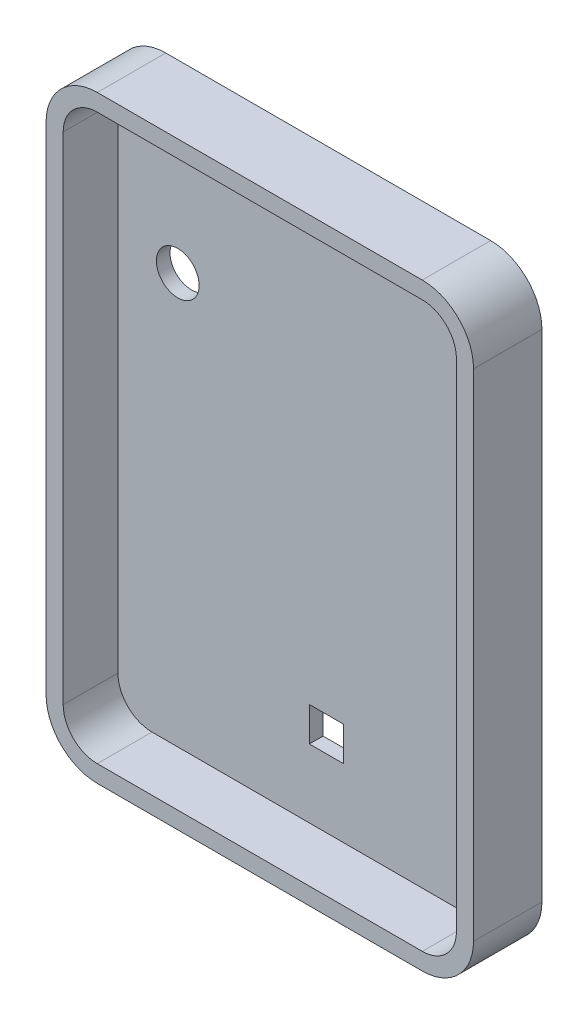
ISO-10303-21;
HEADER;
FILE_DESCRIPTION(('STEP AP214'),'2;1');
FILE_NAME('part.step','',(''),(''),'','','');
FILE_SCHEMA(('AUTOMOTIVE_DESIGN { 1 0 10303 214 1 1 1 1 }'));
ENDSEC;
DATA;
#1=APPLICATION_CONTEXT('core data for automotive mechanical design processes');
#2=APPLICATION_PROTOCOL_DEFINITION('international standard','automotive_design',2000,#1);
#3=PRODUCT_CONTEXT('',#1,'mechanical');
#4=PRODUCT('Part','Part','',(#3));
#5=PRODUCT_RELATED_PRODUCT_CATEGORY('part','',(#4));
#6=PRODUCT_DEFINITION_FORMATION('','',#4);
#7=PRODUCT_DEFINITION_CONTEXT('part definition',#1,'design');
#8=PRODUCT_DEFINITION('design','',#6,#7);
#9=PRODUCT_DEFINITION_SHAPE('','',#8);
#10=(LENGTH_UNIT() NAMED_UNIT(*) SI_UNIT(.MILLI.,.METRE.));
#11=(NAMED_UNIT(*) PLANE_ANGLE_UNIT() SI_UNIT($,.RADIAN.));
#12=(NAMED_UNIT(*) SI_UNIT($,.STERADIAN.) SOLID_ANGLE_UNIT());
#13=UNCERTAINTY_MEASURE_WITH_UNIT(LENGTH_MEASURE(1.E-05),#10,'distance_accuracy_value','');
#14=(GEOMETRIC_REPRESENTATION_CONTEXT(3) GLOBAL_UNCERTAINTY_ASSIGNED_CONTEXT((#13)) GLOBAL_UNIT_ASSIGNED_CONTEXT((#10,
#11,#12)) REPRESENTATION_CONTEXT('',''));
#15=CARTESIAN_POINT('',(0.,0.,0.));
#16=DIRECTION('',(0.,0.,1.));
#17=DIRECTION('',(1.,0.,0.));
#18=AXIS2_PLACEMENT_3D('',#15,#16,#17);
#19=CARTESIAN_POINT('',(0.,0.,0.));
#20=DIRECTION('',(0.,0.,1.));
#21=DIRECTION('',(1.,0.,0.));
#22=AXIS2_PLACEMENT_3D('',#19,#20,#21);
#23=PLANE('',#22);
#24=DIRECTION('',(1.,0.,0.));
#25=VECTOR('',#24,1.);
#26=CARTESIAN_POINT('',(0.,-88.9,0.));
#27=LINE('',#26,#25);
#28=CARTESIAN_POINT('',(7.62000000000001,-88.9,0.));
#29=VERTEX_POINT('',#28);
#30=CARTESIAN_POINT('',(55.88,-88.9,0.));
#31=VERTEX_POINT('',#30);
#32=EDGE_CURVE('E281',#29,#31,#27,.T.);
#33=ORIENTED_EDGE('',*,*,#32,.F.);
#34=CARTESIAN_POINT('',(7.62000000000001,-81.28,0.));
#35=DIRECTION('',(0.,0.,1.));
#36=DIRECTION('',(1.,0.,0.));
#37=AXIS2_PLACEMENT_3D('',#34,#35,#36);
#38=CIRCLE('',#37,7.62);
#39=CARTESIAN_POINT('',(0.,-81.28,0.));
#40=VERTEX_POINT('',#39);
#41=EDGE_CURVE('E299',#29,#40,#38,.F.);
#42=ORIENTED_EDGE('',*,*,#41,.T.);
#43=DIRECTION('',(0.,-1.,0.));
#44=VECTOR('',#43,1.);
#45=CARTESIAN_POINT('',(0.,0.,0.));
#46=LINE('',#45,#44);
#47=CARTESIAN_POINT('',(0.,-7.62,0.));
#48=VERTEX_POINT('',#47);
#49=EDGE_CURVE('E250',#48,#40,#46,.T.);
#50=ORIENTED_EDGE('',*,*,#49,.F.);
#51=CARTESIAN_POINT('',(7.62,-7.62,0.));
#52=DIRECTION('',(0.,0.,1.));
#53=DIRECTION('',(1.,0.,0.));
#54=AXIS2_PLACEMENT_3D('',#51,#52,#53);
#55=CIRCLE('',#54,7.62);
#56=CARTESIAN_POINT('',(7.62,0.,0.));
#57=VERTEX_POINT('',#56);
#58=EDGE_CURVE('E293',#48,#57,#55,.F.);
#59=ORIENTED_EDGE('',*,*,#58,.T.);
#60=DIRECTION('',(-1.,0.,0.));
#61=VECTOR('',#60,1.);
#62=CARTESIAN_POINT('',(0.,0.,0.));
#63=LINE('',#62,#61);
#64=CARTESIAN_POINT('',(55.88,0.,0.));
#65=VERTEX_POINT('',#64);
#66=EDGE_CURVE('E269',#65,#57,#63,.T.);
#67=ORIENTED_EDGE('',*,*,#66,.F.);
#68=CARTESIAN_POINT('',(55.88,-7.62,0.));
#69=DIRECTION('',(0.,0.,1.));
#70=DIRECTION('',(1.,0.,0.));
#71=AXIS2_PLACEMENT_3D('',#68,#69,#70);
#72=CIRCLE('',#71,7.62);
#73=CARTESIAN_POINT('',(63.5,-7.62,0.));
#74=VERTEX_POINT('',#73);
#75=EDGE_CURVE('E295',#65,#74,#72,.F.);
#76=ORIENTED_EDGE('',*,*,#75,.T.);
#77=DIRECTION('',(0.,1.,0.));
#78=VECTOR('',#77,1.);
#79=CARTESIAN_POINT('',(63.5,0.,0.));
#80=LINE('',#79,#78);
#81=CARTESIAN_POINT('',(63.5,-81.28,0.));
#82=VERTEX_POINT('',#81);
#83=EDGE_CURVE('E284',#82,#74,#80,.T.);
#84=ORIENTED_EDGE('',*,*,#83,.F.);
#85=CARTESIAN_POINT('',(55.88,-81.28,0.));
#86=DIRECTION('',(0.,0.,1.));
#87=DIRECTION('',(1.,0.,0.));
#88=AXIS2_PLACEMENT_3D('',#85,#86,#87);
#89=CIRCLE('',#88,7.62);
#90=EDGE_CURVE('E297',#82,#31,#89,.F.);
#91=ORIENTED_EDGE('',*,*,#90,.T.);
#92=EDGE_LOOP('',(#33,#42,#50,#59,#67,#76,#84,#91));
#93=FACE_BOUND('',#92,.T.);
#94=CARTESIAN_POINT('',(11.43,-25.4,0.));
#95=DIRECTION('',(0.,0.,-1.));
#96=DIRECTION('',(-1.,0.,0.));
#97=AXIS2_PLACEMENT_3D('',#94,#95,#96);
#98=CIRCLE('',#97,3.175);
#99=CARTESIAN_POINT('',(8.25500000000001,-25.4,0.));
#100=VERTEX_POINT('',#99);
#101=EDGE_CURVE('E197',#100,#100,#98,.T.);
#102=ORIENTED_EDGE('',*,*,#101,.F.);
#103=EDGE_LOOP('',(#102));
#104=FACE_BOUND('',#103,.T.);
#105=DIRECTION('',(0.,-1.,0.));
#106=VECTOR('',#105,1.);
#107=CARTESIAN_POINT('',(30.988,0.,0.));
#108=LINE('',#107,#106);
#109=CARTESIAN_POINT('',(30.988,-71.12,0.));
#110=VERTEX_POINT('',#109);
#111=CARTESIAN_POINT('',(30.988,-76.2,0.));
#112=VERTEX_POINT('',#111);
#113=EDGE_CURVE('E49',#110,#112,#108,.T.);
#114=ORIENTED_EDGE('',*,*,#113,.T.);
#115=DIRECTION('',(-1.,0.,0.));
#116=VECTOR('',#115,1.);
#117=CARTESIAN_POINT('',(0.,-76.2,0.));
#118=LINE('',#117,#116);
#119=CARTESIAN_POINT('',(36.068,-76.2,0.));
#120=VERTEX_POINT('',#119);
#121=EDGE_CURVE('E187',#120,#112,#118,.T.);
#122=ORIENTED_EDGE('',*,*,#121,.F.);
#123=DIRECTION('',(0.,-1.,0.));
#124=VECTOR('',#123,1.);
#125=CARTESIAN_POINT('',(36.068,0.,0.));
#126=LINE('',#125,#124);
#127=CARTESIAN_POINT('',(36.068,-71.12,0.));
#128=VERTEX_POINT('',#127);
#129=EDGE_CURVE('E173',#128,#120,#126,.T.);
#130=ORIENTED_EDGE('',*,*,#129,.F.);
#131=DIRECTION('',(-1.,0.,0.));
#132=VECTOR('',#131,1.);
#133=CARTESIAN_POINT('',(0.,-71.12,0.));
#134=LINE('',#133,#132);
#135=EDGE_CURVE('E182',#128,#110,#134,.T.);
#136=ORIENTED_EDGE('',*,*,#135,.T.);
#137=EDGE_LOOP('',(#114,#122,#130,#136));
#138=FACE_BOUND('',#137,.T.);
#139=ADVANCED_FACE('F34',(#93,#104,#138),#23,.F.);
#140=CARTESIAN_POINT('',(7.62000000000008,-7.62000000000008,2.032));
#141=DIRECTION('',(0.,0.,-1.));
#142=DIRECTION('',(-1.,0.,0.));
#143=AXIS2_PLACEMENT_3D('',#140,#141,#142);
#144=PLANE('',#143);
#145=CARTESIAN_POINT('',(7.62000000000008,-7.62000000000008,2.032));
#146=DIRECTION('',(0.,0.,1.));
#147=DIRECTION('',(-1.,0.,0.));
#148=AXIS2_PLACEMENT_3D('',#145,#146,#147);
#149=CIRCLE('',#148,5.08000000000008);
#150=CARTESIAN_POINT('',(7.62,-2.54,2.032));
#151=VERTEX_POINT('',#150);
#152=CARTESIAN_POINT('',(2.54,-7.62,2.032));
#153=VERTEX_POINT('',#152);
#154=EDGE_CURVE('E200',#151,#153,#149,.T.);
#155=ORIENTED_EDGE('',*,*,#154,.T.);
#156=DIRECTION('',(0.,-1.,0.));
#157=VECTOR('',#156,1.);
#158=CARTESIAN_POINT('',(2.54,-7.62,2.032));
#159=LINE('',#158,#157);
#160=CARTESIAN_POINT('',(2.54000000000001,-81.296436041524,2.032));
#161=VERTEX_POINT('',#160);
#162=EDGE_CURVE('E203',#153,#161,#159,.T.);
#163=ORIENTED_EDGE('',*,*,#162,.T.);
#164=CARTESIAN_POINT('',(7.60356395847601,-81.296436041524,2.032));
#165=DIRECTION('',(0.,0.,1.));
#166=DIRECTION('',(-1.,0.,0.));
#167=AXIS2_PLACEMENT_3D('',#164,#165,#166);
#168=CIRCLE('',#167,5.063563958476);
#169=CARTESIAN_POINT('',(7.60356395847601,-86.36,2.032));
#170=VERTEX_POINT('',#169);
#171=EDGE_CURVE('E207',#161,#170,#168,.T.);
#172=ORIENTED_EDGE('',*,*,#171,.T.);
#173=DIRECTION('',(1.,0.,0.));
#174=VECTOR('',#173,1.);
#175=CARTESIAN_POINT('',(55.8964360415239,-86.36,2.032));
#176=LINE('',#175,#174);
#177=CARTESIAN_POINT('',(55.8964360415239,-86.36,2.032));
#178=VERTEX_POINT('',#177);
#179=EDGE_CURVE('E210',#170,#178,#176,.T.);
#180=ORIENTED_EDGE('',*,*,#179,.T.);
#181=CARTESIAN_POINT('',(55.8964360415239,-81.2964360415238,2.032));
#182=DIRECTION('',(0.,0.,1.));
#183=DIRECTION('',(-1.,0.,0.));
#184=AXIS2_PLACEMENT_3D('',#181,#182,#183);
#185=CIRCLE('',#184,5.06356395847615);
#186=CARTESIAN_POINT('',(60.96,-81.2964360415238,2.032));
#187=VERTEX_POINT('',#186);
#188=EDGE_CURVE('E213',#178,#187,#185,.T.);
#189=ORIENTED_EDGE('',*,*,#188,.T.);
#190=DIRECTION('',(0.,1.,0.));
#191=VECTOR('',#190,1.);
#192=CARTESIAN_POINT('',(60.96,-7.62,2.032));
#193=LINE('',#192,#191);
#194=CARTESIAN_POINT('',(60.96,-7.62,2.032));
#195=VERTEX_POINT('',#194);
#196=EDGE_CURVE('E216',#187,#195,#193,.T.);
#197=ORIENTED_EDGE('',*,*,#196,.T.);
#198=CARTESIAN_POINT('',(55.88,-7.62000000000004,2.032));
#199=DIRECTION('',(0.,0.,1.));
#200=DIRECTION('',(-1.,0.,0.));
#201=AXIS2_PLACEMENT_3D('',#198,#199,#200);
#202=CIRCLE('',#201,5.08000000000004);
#203=CARTESIAN_POINT('',(55.88,-2.54,2.032));
#204=VERTEX_POINT('',#203);
#205=EDGE_CURVE('E219',#195,#204,#202,.T.);
#206=ORIENTED_EDGE('',*,*,#205,.T.);
#207=DIRECTION('',(-1.,0.,0.));
#208=VECTOR('',#207,1.);
#209=CARTESIAN_POINT('',(7.62,-2.54,2.032));
#210=LINE('',#209,#208);
#211=EDGE_CURVE('E222',#204,#151,#210,.T.);
#212=ORIENTED_EDGE('',*,*,#211,.T.);
#213=EDGE_LOOP('',(#155,#163,#172,#180,#189,#197,#206,#212));
#214=FACE_BOUND('',#213,.T.);
#215=CARTESIAN_POINT('',(11.43,-25.4,2.032));
#216=DIRECTION('',(0.,0.,-1.));
#217=DIRECTION('',(-1.,0.,0.));
#218=AXIS2_PLACEMENT_3D('',#215,#216,#217);
#219=CIRCLE('',#218,3.175);
#220=CARTESIAN_POINT('',(8.25500000000001,-25.4,2.032));
#221=VERTEX_POINT('',#220);
#222=EDGE_CURVE('E194',#221,#221,#219,.T.);
#223=ORIENTED_EDGE('',*,*,#222,.T.);
#224=EDGE_LOOP('',(#223));
#225=FACE_BOUND('',#224,.T.);
#226=DIRECTION('',(0.,-1.,0.));
#227=VECTOR('',#226,1.);
#228=CARTESIAN_POINT('',(30.988,-7.62000000000008,2.032));
#229=LINE('',#228,#227);
#230=CARTESIAN_POINT('',(30.988,-71.12,2.032));
#231=VERTEX_POINT('',#230);
#232=CARTESIAN_POINT('',(30.988,-76.2,2.032));
#233=VERTEX_POINT('',#232);
#234=EDGE_CURVE('E11',#231,#233,#229,.T.);
#235=ORIENTED_EDGE('',*,*,#234,.F.);
#236=DIRECTION('',(-1.,0.,0.));
#237=VECTOR('',#236,1.);
#238=CARTESIAN_POINT('',(7.62000000000008,-71.12,2.032));
#239=LINE('',#238,#237);
#240=CARTESIAN_POINT('',(36.068,-71.12,2.032));
#241=VERTEX_POINT('',#240);
#242=EDGE_CURVE('E324',#241,#231,#239,.T.);
#243=ORIENTED_EDGE('',*,*,#242,.F.);
#244=DIRECTION('',(0.,-1.,0.));
#245=VECTOR('',#244,1.);
#246=CARTESIAN_POINT('',(36.068,-7.62000000000008,2.032));
#247=LINE('',#246,#245);
#248=CARTESIAN_POINT('',(36.068,-76.2,2.032));
#249=VERTEX_POINT('',#248);
#250=EDGE_CURVE('E176',#241,#249,#247,.T.);
#251=ORIENTED_EDGE('',*,*,#250,.T.);
#252=DIRECTION('',(-1.,0.,0.));
#253=VECTOR('',#252,1.);
#254=CARTESIAN_POINT('',(7.62000000000008,-76.2,2.032));
#255=LINE('',#254,#253);
#256=EDGE_CURVE('E42',#249,#233,#255,.T.);
#257=ORIENTED_EDGE('',*,*,#256,.T.);
#258=EDGE_LOOP('',(#235,#243,#251,#257));
#259=FACE_BOUND('',#258,.T.);
#260=ADVANCED_FACE('F331',(#214,#225,#259),#144,.F.);
#261=CARTESIAN_POINT('',(0.,0.,10.16));
#262=DIRECTION('',(1.,0.,0.));
#263=DIRECTION('',(0.,1.,0.));
#264=AXIS2_PLACEMENT_3D('',#261,#262,#263);
#265=PLANE('',#264);
#266=ORIENTED_EDGE('',*,*,#49,.T.);
#267=DIRECTION('',(0.,0.,-1.));
#268=VECTOR('',#267,1.);
#269=CARTESIAN_POINT('',(0.,-81.28,10.16));
#270=LINE('',#269,#268);
#271=CARTESIAN_POINT('',(0.,-81.28,10.16));
#272=VERTEX_POINT('',#271);
#273=EDGE_CURVE('E304',#40,#272,#270,.F.);
#274=ORIENTED_EDGE('',*,*,#273,.T.);
#275=DIRECTION('',(0.,-1.,0.));
#276=VECTOR('',#275,1.);
#277=CARTESIAN_POINT('',(0.,0.,10.16));
#278=LINE('',#277,#276);
#279=CARTESIAN_POINT('',(0.,-7.62,10.16));
#280=VERTEX_POINT('',#279);
#281=EDGE_CURVE('E265',#280,#272,#278,.T.);
#282=ORIENTED_EDGE('',*,*,#281,.F.);
#283=DIRECTION('',(0.,0.,-1.));
#284=VECTOR('',#283,1.);
#285=CARTESIAN_POINT('',(0.,-7.62,10.16));
#286=LINE('',#285,#284);
#287=EDGE_CURVE('E301',#280,#48,#286,.T.);
#288=ORIENTED_EDGE('',*,*,#287,.T.);
#289=EDGE_LOOP('',(#266,#274,#282,#288));
#290=FACE_BOUND('',#289,.T.);
#291=ADVANCED_FACE('F354',(#290),#265,.F.);
#292=CARTESIAN_POINT('',(0.,-88.9,10.16));
#293=DIRECTION('',(0.,1.,0.));
#294=DIRECTION('',(0.,0.,1.));
#295=AXIS2_PLACEMENT_3D('',#292,#293,#294);
#296=PLANE('',#295);
#297=DIRECTION('',(1.,0.,0.));
#298=VECTOR('',#297,1.);
#299=CARTESIAN_POINT('',(0.,-88.9,10.16));
#300=LINE('',#299,#298);
#301=CARTESIAN_POINT('',(7.62000000000001,-88.9,10.16));
#302=VERTEX_POINT('',#301);
#303=CARTESIAN_POINT('',(55.88,-88.9,10.16));
#304=VERTEX_POINT('',#303);
#305=EDGE_CURVE('E268',#302,#304,#300,.T.);
#306=ORIENTED_EDGE('',*,*,#305,.F.);
#307=DIRECTION('',(0.,0.,-1.));
#308=VECTOR('',#307,1.);
#309=CARTESIAN_POINT('',(7.62000000000001,-88.9,10.16));
#310=LINE('',#309,#308);
#311=EDGE_CURVE('E290',#302,#29,#310,.T.);
#312=ORIENTED_EDGE('',*,*,#311,.T.);
#313=ORIENTED_EDGE('',*,*,#32,.T.);
#314=DIRECTION('',(0.,0.,-1.));
#315=VECTOR('',#314,1.);
#316=CARTESIAN_POINT('',(55.88,-88.9,10.16));
#317=LINE('',#316,#315);
#318=EDGE_CURVE('E278',#31,#304,#317,.F.);
#319=ORIENTED_EDGE('',*,*,#318,.T.);
#320=EDGE_LOOP('',(#306,#312,#313,#319));
#321=FACE_BOUND('',#320,.T.);
#322=ADVANCED_FACE('F370',(#321),#296,.F.);
#323=CARTESIAN_POINT('',(63.5,0.,10.16));
#324=DIRECTION('',(-1.,0.,0.));
#325=DIRECTION('',(0.,-1.,0.));
#326=AXIS2_PLACEMENT_3D('',#323,#324,#325);
#327=PLANE('',#326);
#328=DIRECTION('',(0.,1.,0.));
#329=VECTOR('',#328,1.);
#330=CARTESIAN_POINT('',(63.5,0.,10.16));
#331=LINE('',#330,#329);
#332=CARTESIAN_POINT('',(63.5,-81.28,10.16));
#333=VERTEX_POINT('',#332);
#334=CARTESIAN_POINT('',(63.5,-7.62,10.16));
#335=VERTEX_POINT('',#334);
#336=EDGE_CURVE('E272',#333,#335,#331,.T.);
#337=ORIENTED_EDGE('',*,*,#336,.F.);
#338=DIRECTION('',(0.,0.,-1.));
#339=VECTOR('',#338,1.);
#340=CARTESIAN_POINT('',(63.5,-81.28,10.16));
#341=LINE('',#340,#339);
#342=EDGE_CURVE('E316',#333,#82,#341,.T.);
#343=ORIENTED_EDGE('',*,*,#342,.T.);
#344=ORIENTED_EDGE('',*,*,#83,.T.);
#345=DIRECTION('',(0.,0.,-1.));
#346=VECTOR('',#345,1.);
#347=CARTESIAN_POINT('',(63.5,-7.62,10.16));
#348=LINE('',#347,#346);
#349=EDGE_CURVE('E314',#74,#335,#348,.F.);
#350=ORIENTED_EDGE('',*,*,#349,.T.);
#351=EDGE_LOOP('',(#337,#343,#344,#350));
#352=FACE_BOUND('',#351,.T.);
#353=ADVANCED_FACE('F366',(#352),#327,.F.);
#354=CARTESIAN_POINT('',(0.,0.,10.16));
#355=DIRECTION('',(0.,-1.,0.));
#356=DIRECTION('',(0.,0.,-1.));
#357=AXIS2_PLACEMENT_3D('',#354,#355,#356);
#358=PLANE('',#357);
#359=DIRECTION('',(-1.,0.,0.));
#360=VECTOR('',#359,1.);
#361=CARTESIAN_POINT('',(0.,0.,10.16));
#362=LINE('',#361,#360);
#363=CARTESIAN_POINT('',(55.88,0.,10.16));
#364=VERTEX_POINT('',#363);
#365=CARTESIAN_POINT('',(7.62,0.,10.16));
#366=VERTEX_POINT('',#365);
#367=EDGE_CURVE('E275',#364,#366,#362,.T.);
#368=ORIENTED_EDGE('',*,*,#367,.F.);
#369=DIRECTION('',(0.,0.,-1.));
#370=VECTOR('',#369,1.);
#371=CARTESIAN_POINT('',(55.88,0.,10.16));
#372=LINE('',#371,#370);
#373=EDGE_CURVE('E321',#364,#65,#372,.T.);
#374=ORIENTED_EDGE('',*,*,#373,.T.);
#375=ORIENTED_EDGE('',*,*,#66,.T.);
#376=DIRECTION('',(0.,0.,-1.));
#377=VECTOR('',#376,1.);
#378=CARTESIAN_POINT('',(7.62,0.,10.16));
#379=LINE('',#378,#377);
#380=EDGE_CURVE('E319',#57,#366,#379,.F.);
#381=ORIENTED_EDGE('',*,*,#380,.T.);
#382=EDGE_LOOP('',(#368,#374,#375,#381));
#383=FACE_BOUND('',#382,.T.);
#384=ADVANCED_FACE('F363',(#383),#358,.F.);
#385=CARTESIAN_POINT('',(0.,0.,10.16));
#386=DIRECTION('',(0.,0.,1.));
#387=DIRECTION('',(1.,0.,0.));
#388=AXIS2_PLACEMENT_3D('',#385,#386,#387);
#389=PLANE('',#388);
#390=CARTESIAN_POINT('',(7.62000000000008,-7.62000000000008,10.16));
#391=DIRECTION('',(0.,0.,1.));
#392=DIRECTION('',(-1.,0.,0.));
#393=AXIS2_PLACEMENT_3D('',#390,#391,#392);
#394=CIRCLE('',#393,5.08000000000008);
#395=CARTESIAN_POINT('',(7.62,-2.54,10.16));
#396=VERTEX_POINT('',#395);
#397=CARTESIAN_POINT('',(2.54,-7.62,10.16));
#398=VERTEX_POINT('',#397);
#399=EDGE_CURVE('E226',#396,#398,#394,.T.);
#400=ORIENTED_EDGE('',*,*,#399,.F.);
#401=DIRECTION('',(-1.,0.,0.));
#402=VECTOR('',#401,1.);
#403=CARTESIAN_POINT('',(7.62,-2.54,10.16));
#404=LINE('',#403,#402);
#405=CARTESIAN_POINT('',(55.88,-2.54,10.16));
#406=VERTEX_POINT('',#405);
#407=EDGE_CURVE('E204',#406,#396,#404,.T.);
#408=ORIENTED_EDGE('',*,*,#407,.F.);
#409=CARTESIAN_POINT('',(55.88,-7.62000000000004,10.16));
#410=DIRECTION('',(0.,0.,1.));
#411=DIRECTION('',(-1.,0.,0.));
#412=AXIS2_PLACEMENT_3D('',#409,#410,#411);
#413=CIRCLE('',#412,5.08000000000004);
#414=CARTESIAN_POINT('',(60.96,-7.62,10.16));
#415=VERTEX_POINT('',#414);
#416=EDGE_CURVE('E243',#415,#406,#413,.T.);
#417=ORIENTED_EDGE('',*,*,#416,.F.);
#418=DIRECTION('',(0.,1.,0.));
#419=VECTOR('',#418,1.);
#420=CARTESIAN_POINT('',(60.96,-7.62,10.16));
#421=LINE('',#420,#419);
#422=CARTESIAN_POINT('',(60.96,-81.2964360415238,10.16));
#423=VERTEX_POINT('',#422);
#424=EDGE_CURVE('E240',#423,#415,#421,.T.);
#425=ORIENTED_EDGE('',*,*,#424,.F.);
#426=CARTESIAN_POINT('',(55.8964360415239,-81.2964360415238,10.16));
#427=DIRECTION('',(0.,0.,1.));
#428=DIRECTION('',(-1.,0.,0.));
#429=AXIS2_PLACEMENT_3D('',#426,#427,#428);
#430=CIRCLE('',#429,5.06356395847615);
#431=CARTESIAN_POINT('',(55.8964360415239,-86.36,10.16));
#432=VERTEX_POINT('',#431);
#433=EDGE_CURVE('E237',#432,#423,#430,.T.);
#434=ORIENTED_EDGE('',*,*,#433,.F.);
#435=DIRECTION('',(1.,0.,0.));
#436=VECTOR('',#435,1.);
#437=CARTESIAN_POINT('',(55.8964360415239,-86.36,10.16));
#438=LINE('',#437,#436);
#439=CARTESIAN_POINT('',(7.60356395847601,-86.36,10.16));
#440=VERTEX_POINT('',#439);
#441=EDGE_CURVE('E234',#440,#432,#438,.T.);
#442=ORIENTED_EDGE('',*,*,#441,.F.);
#443=CARTESIAN_POINT('',(7.60356395847601,-81.296436041524,10.16));
#444=DIRECTION('',(0.,0.,1.));
#445=DIRECTION('',(-1.,0.,0.));
#446=AXIS2_PLACEMENT_3D('',#443,#444,#445);
#447=CIRCLE('',#446,5.063563958476);
#448=CARTESIAN_POINT('',(2.54000000000001,-81.296436041524,10.16));
#449=VERTEX_POINT('',#448);
#450=EDGE_CURVE('E231',#449,#440,#447,.T.);
#451=ORIENTED_EDGE('',*,*,#450,.F.);
#452=DIRECTION('',(0.,-1.,0.));
#453=VECTOR('',#452,1.);
#454=CARTESIAN_POINT('',(2.54,-7.62,10.16));
#455=LINE('',#454,#453);
#456=EDGE_CURVE('E228',#398,#449,#455,.T.);
#457=ORIENTED_EDGE('',*,*,#456,.F.);
#458=EDGE_LOOP('',(#400,#408,#417,#425,#434,#442,#451,#457));
#459=FACE_BOUND('',#458,.T.);
#460=ORIENTED_EDGE('',*,*,#281,.T.);
#461=CARTESIAN_POINT('',(7.62000000000001,-81.28,10.16));
#462=DIRECTION('',(0.,0.,1.));
#463=DIRECTION('',(1.,0.,0.));
#464=AXIS2_PLACEMENT_3D('',#461,#462,#463);
#465=CIRCLE('',#464,7.62);
#466=EDGE_CURVE('E312',#272,#302,#465,.T.);
#467=ORIENTED_EDGE('',*,*,#466,.T.);
#468=ORIENTED_EDGE('',*,*,#305,.T.);
#469=CARTESIAN_POINT('',(55.88,-81.28,10.16));
#470=DIRECTION('',(0.,0.,1.));
#471=DIRECTION('',(1.,0.,0.));
#472=AXIS2_PLACEMENT_3D('',#469,#470,#471);
#473=CIRCLE('',#472,7.62);
#474=EDGE_CURVE('E310',#304,#333,#473,.T.);
#475=ORIENTED_EDGE('',*,*,#474,.T.);
#476=ORIENTED_EDGE('',*,*,#336,.T.);
#477=CARTESIAN_POINT('',(55.88,-7.62,10.16));
#478=DIRECTION('',(0.,0.,1.));
#479=DIRECTION('',(1.,0.,0.));
#480=AXIS2_PLACEMENT_3D('',#477,#478,#479);
#481=CIRCLE('',#480,7.62);
#482=EDGE_CURVE('E308',#335,#364,#481,.T.);
#483=ORIENTED_EDGE('',*,*,#482,.T.);
#484=ORIENTED_EDGE('',*,*,#367,.T.);
#485=CARTESIAN_POINT('',(7.62,-7.62,10.16));
#486=DIRECTION('',(0.,0.,1.));
#487=DIRECTION('',(1.,0.,0.));
#488=AXIS2_PLACEMENT_3D('',#485,#486,#487);
#489=CIRCLE('',#488,7.62);
#490=EDGE_CURVE('E306',#366,#280,#489,.T.);
#491=ORIENTED_EDGE('',*,*,#490,.T.);
#492=EDGE_LOOP('',(#460,#467,#468,#475,#476,#483,#484,#491));
#493=FACE_BOUND('',#492,.T.);
#494=ADVANCED_FACE('F361',(#459,#493),#389,.T.);
#495=CARTESIAN_POINT('',(7.62000000000001,-81.28,10.16));
#496=DIRECTION('',(0.,0.,-1.));
#497=DIRECTION('',(-1.,0.,0.));
#498=AXIS2_PLACEMENT_3D('',#495,#496,#497);
#499=CYLINDRICAL_SURFACE('',#498,7.62);
#500=ORIENTED_EDGE('',*,*,#466,.F.);
#501=ORIENTED_EDGE('',*,*,#273,.F.);
#502=ORIENTED_EDGE('',*,*,#41,.F.);
#503=ORIENTED_EDGE('',*,*,#311,.F.);
#504=EDGE_LOOP('',(#500,#501,#502,#503));
#505=FACE_BOUND('',#504,.T.);
#506=ADVANCED_FACE('F378',(#505),#499,.T.);
#507=CARTESIAN_POINT('',(55.88,-81.28,10.16));
#508=DIRECTION('',(0.,0.,-1.));
#509=DIRECTION('',(-1.,0.,0.));
#510=AXIS2_PLACEMENT_3D('',#507,#508,#509);
#511=CYLINDRICAL_SURFACE('',#510,7.62);
#512=ORIENTED_EDGE('',*,*,#474,.F.);
#513=ORIENTED_EDGE('',*,*,#318,.F.);
#514=ORIENTED_EDGE('',*,*,#90,.F.);
#515=ORIENTED_EDGE('',*,*,#342,.F.);
#516=EDGE_LOOP('',(#512,#513,#514,#515));
#517=FACE_BOUND('',#516,.T.);
#518=ADVANCED_FACE('F381',(#517),#511,.T.);
#519=CARTESIAN_POINT('',(55.88,-7.62,10.16));
#520=DIRECTION('',(0.,0.,-1.));
#521=DIRECTION('',(-1.,0.,0.));
#522=AXIS2_PLACEMENT_3D('',#519,#520,#521);
#523=CYLINDRICAL_SURFACE('',#522,7.62);
#524=ORIENTED_EDGE('',*,*,#482,.F.);
#525=ORIENTED_EDGE('',*,*,#349,.F.);
#526=ORIENTED_EDGE('',*,*,#75,.F.);
#527=ORIENTED_EDGE('',*,*,#373,.F.);
#528=EDGE_LOOP('',(#524,#525,#526,#527));
#529=FACE_BOUND('',#528,.T.);
#530=ADVANCED_FACE('F384',(#529),#523,.T.);
#531=CARTESIAN_POINT('',(7.62,-7.62,10.16));
#532=DIRECTION('',(0.,0.,-1.));
#533=DIRECTION('',(-1.,0.,0.));
#534=AXIS2_PLACEMENT_3D('',#531,#532,#533);
#535=CYLINDRICAL_SURFACE('',#534,7.62);
#536=ORIENTED_EDGE('',*,*,#490,.F.);
#537=ORIENTED_EDGE('',*,*,#380,.F.);
#538=ORIENTED_EDGE('',*,*,#58,.F.);
#539=ORIENTED_EDGE('',*,*,#287,.F.);
#540=EDGE_LOOP('',(#536,#537,#538,#539));
#541=FACE_BOUND('',#540,.T.);
#542=ADVANCED_FACE('F36',(#541),#535,.T.);
#543=CARTESIAN_POINT('',(7.62000000000008,-7.62000000000008,2.032));
#544=DIRECTION('',(0.,0.,1.));
#545=DIRECTION('',(1.,0.,0.));
#546=AXIS2_PLACEMENT_3D('',#543,#544,#545);
#547=CYLINDRICAL_SURFACE('',#546,5.08000000000008);
#548=ORIENTED_EDGE('',*,*,#399,.T.);
#549=DIRECTION('',(0.,0.,1.));
#550=VECTOR('',#549,1.);
#551=CARTESIAN_POINT('',(2.54,-7.62,2.032));
#552=LINE('',#551,#550);
#553=EDGE_CURVE('E225',#153,#398,#552,.T.);
#554=ORIENTED_EDGE('',*,*,#553,.F.);
#555=ORIENTED_EDGE('',*,*,#154,.F.);
#556=DIRECTION('',(0.,0.,1.));
#557=VECTOR('',#556,1.);
#558=CARTESIAN_POINT('',(7.62,-2.54,2.032));
#559=LINE('',#558,#557);
#560=EDGE_CURVE('E248',#151,#396,#559,.T.);
#561=ORIENTED_EDGE('',*,*,#560,.T.);
#562=EDGE_LOOP('',(#548,#554,#555,#561));
#563=FACE_BOUND('',#562,.T.);
#564=ADVANCED_FACE('F391',(#563),#547,.F.);
#565=CARTESIAN_POINT('',(7.62,-2.54,2.032));
#566=DIRECTION('',(0.,1.,0.));
#567=DIRECTION('',(0.,0.,1.));
#568=AXIS2_PLACEMENT_3D('',#565,#566,#567);
#569=PLANE('',#568);
#570=ORIENTED_EDGE('',*,*,#407,.T.);
#571=ORIENTED_EDGE('',*,*,#560,.F.);
#572=ORIENTED_EDGE('',*,*,#211,.F.);
#573=DIRECTION('',(0.,0.,1.));
#574=VECTOR('',#573,1.);
#575=CARTESIAN_POINT('',(55.88,-2.54,2.032));
#576=LINE('',#575,#574);
#577=EDGE_CURVE('E251',#204,#406,#576,.T.);
#578=ORIENTED_EDGE('',*,*,#577,.T.);
#579=EDGE_LOOP('',(#570,#571,#572,#578));
#580=FACE_BOUND('',#579,.T.);
#581=ADVANCED_FACE('F431',(#580),#569,.F.);
#582=CARTESIAN_POINT('',(55.88,-7.62000000000004,2.032));
#583=DIRECTION('',(0.,0.,1.));
#584=DIRECTION('',(1.,0.,0.));
#585=AXIS2_PLACEMENT_3D('',#582,#583,#584);
#586=CYLINDRICAL_SURFACE('',#585,5.08000000000004);
#587=ORIENTED_EDGE('',*,*,#416,.T.);
#588=ORIENTED_EDGE('',*,*,#577,.F.);
#589=ORIENTED_EDGE('',*,*,#205,.F.);
#590=DIRECTION('',(0.,0.,1.));
#591=VECTOR('',#590,1.);
#592=CARTESIAN_POINT('',(60.96,-7.62,2.032));
#593=LINE('',#592,#591);
#594=EDGE_CURVE('E253',#195,#415,#593,.T.);
#595=ORIENTED_EDGE('',*,*,#594,.T.);
#596=EDGE_LOOP('',(#587,#588,#589,#595));
#597=FACE_BOUND('',#596,.T.);
#598=ADVANCED_FACE('F433',(#597),#586,.F.);
#599=CARTESIAN_POINT('',(60.96,-7.62,2.032));
#600=DIRECTION('',(1.,0.,0.));
#601=DIRECTION('',(0.,0.,-1.));
#602=AXIS2_PLACEMENT_3D('',#599,#600,#601);
#603=PLANE('',#602);
#604=ORIENTED_EDGE('',*,*,#424,.T.);
#605=ORIENTED_EDGE('',*,*,#594,.F.);
#606=ORIENTED_EDGE('',*,*,#196,.F.);
#607=DIRECTION('',(0.,0.,1.));
#608=VECTOR('',#607,1.);
#609=CARTESIAN_POINT('',(60.96,-81.2964360415238,2.032));
#610=LINE('',#609,#608);
#611=EDGE_CURVE('E255',#187,#423,#610,.T.);
#612=ORIENTED_EDGE('',*,*,#611,.T.);
#613=EDGE_LOOP('',(#604,#605,#606,#612));
#614=FACE_BOUND('',#613,.T.);
#615=ADVANCED_FACE('F438',(#614),#603,.F.);
#616=CARTESIAN_POINT('',(55.8964360415239,-81.2964360415238,2.032));
#617=DIRECTION('',(0.,0.,1.));
#618=DIRECTION('',(1.,0.,0.));
#619=AXIS2_PLACEMENT_3D('',#616,#617,#618);
#620=CYLINDRICAL_SURFACE('',#619,5.06356395847615);
#621=ORIENTED_EDGE('',*,*,#433,.T.);
#622=ORIENTED_EDGE('',*,*,#611,.F.);
#623=ORIENTED_EDGE('',*,*,#188,.F.);
#624=DIRECTION('',(0.,0.,1.));
#625=VECTOR('',#624,1.);
#626=CARTESIAN_POINT('',(55.8964360415239,-86.36,2.032));
#627=LINE('',#626,#625);
#628=EDGE_CURVE('E257',#178,#432,#627,.T.);
#629=ORIENTED_EDGE('',*,*,#628,.T.);
#630=EDGE_LOOP('',(#621,#622,#623,#629));
#631=FACE_BOUND('',#630,.T.);
#632=ADVANCED_FACE('F442',(#631),#620,.F.);
#633=CARTESIAN_POINT('',(55.8964360415239,-86.36,2.032));
#634=DIRECTION('',(0.,-1.,0.));
#635=DIRECTION('',(1.,0.,0.));
#636=AXIS2_PLACEMENT_3D('',#633,#634,#635);
#637=PLANE('',#636);
#638=ORIENTED_EDGE('',*,*,#441,.T.);
#639=ORIENTED_EDGE('',*,*,#628,.F.);
#640=ORIENTED_EDGE('',*,*,#179,.F.);
#641=DIRECTION('',(0.,0.,1.));
#642=VECTOR('',#641,1.);
#643=CARTESIAN_POINT('',(7.60356395847601,-86.36,2.032));
#644=LINE('',#643,#642);
#645=EDGE_CURVE('E259',#170,#440,#644,.T.);
#646=ORIENTED_EDGE('',*,*,#645,.T.);
#647=EDGE_LOOP('',(#638,#639,#640,#646));
#648=FACE_BOUND('',#647,.T.);
#649=ADVANCED_FACE('F445',(#648),#637,.F.);
#650=CARTESIAN_POINT('',(7.60356395847601,-81.296436041524,2.032));
#651=DIRECTION('',(0.,0.,1.));
#652=DIRECTION('',(1.,0.,0.));
#653=AXIS2_PLACEMENT_3D('',#650,#651,#652);
#654=CYLINDRICAL_SURFACE('',#653,5.063563958476);
#655=ORIENTED_EDGE('',*,*,#450,.T.);
#656=ORIENTED_EDGE('',*,*,#645,.F.);
#657=ORIENTED_EDGE('',*,*,#171,.F.);
#658=DIRECTION('',(0.,0.,1.));
#659=VECTOR('',#658,1.);
#660=CARTESIAN_POINT('',(2.54000000000001,-81.296436041524,2.032));
#661=LINE('',#660,#659);
#662=EDGE_CURVE('E261',#161,#449,#661,.T.);
#663=ORIENTED_EDGE('',*,*,#662,.T.);
#664=EDGE_LOOP('',(#655,#656,#657,#663));
#665=FACE_BOUND('',#664,.T.);
#666=ADVANCED_FACE('F447',(#665),#654,.F.);
#667=CARTESIAN_POINT('',(2.54,-7.62,2.032));
#668=DIRECTION('',(-1.,0.,0.));
#669=DIRECTION('',(0.,-1.,0.));
#670=AXIS2_PLACEMENT_3D('',#667,#668,#669);
#671=PLANE('',#670);
#672=ORIENTED_EDGE('',*,*,#456,.T.);
#673=ORIENTED_EDGE('',*,*,#662,.F.);
#674=ORIENTED_EDGE('',*,*,#162,.F.);
#675=ORIENTED_EDGE('',*,*,#553,.T.);
#676=EDGE_LOOP('',(#672,#673,#674,#675));
#677=FACE_BOUND('',#676,.T.);
#678=ADVANCED_FACE('F344',(#677),#671,.F.);
#679=CARTESIAN_POINT('',(11.43,-25.4,12.7));
#680=DIRECTION('',(0.,0.,-1.));
#681=DIRECTION('',(-1.,0.,0.));
#682=AXIS2_PLACEMENT_3D('',#679,#680,#681);
#683=CYLINDRICAL_SURFACE('',#682,3.175);
#684=ORIENTED_EDGE('',*,*,#101,.T.);
#685=EDGE_LOOP('',(#684));
#686=FACE_BOUND('',#685,.T.);
#687=ORIENTED_EDGE('',*,*,#222,.F.);
#688=EDGE_LOOP('',(#687));
#689=FACE_BOUND('',#688,.T.);
#690=ADVANCED_FACE('F337',(#686,#689),#683,.F.);
#691=CARTESIAN_POINT('',(30.988,0.,12.7));
#692=DIRECTION('',(1.,0.,0.));
#693=DIRECTION('',(0.,0.,-1.));
#694=AXIS2_PLACEMENT_3D('',#691,#692,#693);
#695=PLANE('',#694);
#696=ORIENTED_EDGE('',*,*,#234,.T.);
#697=DIRECTION('',(0.,0.,-1.));
#698=VECTOR('',#697,1.);
#699=CARTESIAN_POINT('',(30.988,-76.2,12.7));
#700=LINE('',#699,#698);
#701=EDGE_CURVE('E192',#233,#112,#700,.T.);
#702=ORIENTED_EDGE('',*,*,#701,.T.);
#703=ORIENTED_EDGE('',*,*,#113,.F.);
#704=DIRECTION('',(0.,0.,-1.));
#705=VECTOR('',#704,1.);
#706=CARTESIAN_POINT('',(30.988,-71.12,12.7));
#707=LINE('',#706,#705);
#708=EDGE_CURVE('E179',#231,#110,#707,.T.);
#709=ORIENTED_EDGE('',*,*,#708,.F.);
#710=EDGE_LOOP('',(#696,#702,#703,#709));
#711=FACE_BOUND('',#710,.T.);
#712=ADVANCED_FACE('F335',(#711),#695,.T.);
#713=CARTESIAN_POINT('',(0.,-76.2,12.7));
#714=DIRECTION('',(0.,-1.,0.));
#715=DIRECTION('',(0.,0.,-1.));
#716=AXIS2_PLACEMENT_3D('',#713,#714,#715);
#717=PLANE('',#716);
#718=DIRECTION('',(0.,0.,-1.));
#719=VECTOR('',#718,1.);
#720=CARTESIAN_POINT('',(36.068,-76.2,12.7));
#721=LINE('',#720,#719);
#722=EDGE_CURVE('E178',#249,#120,#721,.T.);
#723=ORIENTED_EDGE('',*,*,#722,.T.);
#724=ORIENTED_EDGE('',*,*,#121,.T.);
#725=ORIENTED_EDGE('',*,*,#701,.F.);
#726=ORIENTED_EDGE('',*,*,#256,.F.);
#727=EDGE_LOOP('',(#723,#724,#725,#726));
#728=FACE_BOUND('',#727,.T.);
#729=ADVANCED_FACE('F334',(#728),#717,.F.);
#730=CARTESIAN_POINT('',(36.068,0.,12.7));
#731=DIRECTION('',(1.,0.,0.));
#732=DIRECTION('',(0.,0.,-1.));
#733=AXIS2_PLACEMENT_3D('',#730,#731,#732);
#734=PLANE('',#733);
#735=DIRECTION('',(0.,0.,-1.));
#736=VECTOR('',#735,1.);
#737=CARTESIAN_POINT('',(36.068,-71.12,12.7));
#738=LINE('',#737,#736);
#739=EDGE_CURVE('E57',#241,#128,#738,.T.);
#740=ORIENTED_EDGE('',*,*,#739,.T.);
#741=ORIENTED_EDGE('',*,*,#129,.T.);
#742=ORIENTED_EDGE('',*,*,#722,.F.);
#743=ORIENTED_EDGE('',*,*,#250,.F.);
#744=EDGE_LOOP('',(#740,#741,#742,#743));
#745=FACE_BOUND('',#744,.T.);
#746=ADVANCED_FACE('F170',(#745),#734,.F.);
#747=CARTESIAN_POINT('',(0.,-71.12,12.7));
#748=DIRECTION('',(0.,-1.,0.));
#749=DIRECTION('',(0.,0.,-1.));
#750=AXIS2_PLACEMENT_3D('',#747,#748,#749);
#751=PLANE('',#750);
#752=ORIENTED_EDGE('',*,*,#242,.T.);
#753=ORIENTED_EDGE('',*,*,#708,.T.);
#754=ORIENTED_EDGE('',*,*,#135,.F.);
#755=ORIENTED_EDGE('',*,*,#739,.F.);
#756=EDGE_LOOP('',(#752,#753,#754,#755));
#757=FACE_BOUND('',#756,.T.);
#758=ADVANCED_FACE('F183',(#757),#751,.T.);
#759=CLOSED_SHELL('',(#139,#260,#291,#322,#353,#384,#494,#506,#518,#530,#542,#564,#581,#598,
#615,#632,#649,#666,#678,#690,#712,#729,#746,#758));
#760=MANIFOLD_SOLID_BREP('B2',#759);
#761=ADVANCED_BREP_SHAPE_REPRESENTATION('',(#18,#760),#14);
#762=SHAPE_DEFINITION_REPRESENTATION(#9,#761);
ENDSEC;
END-ISO-10303-21;
